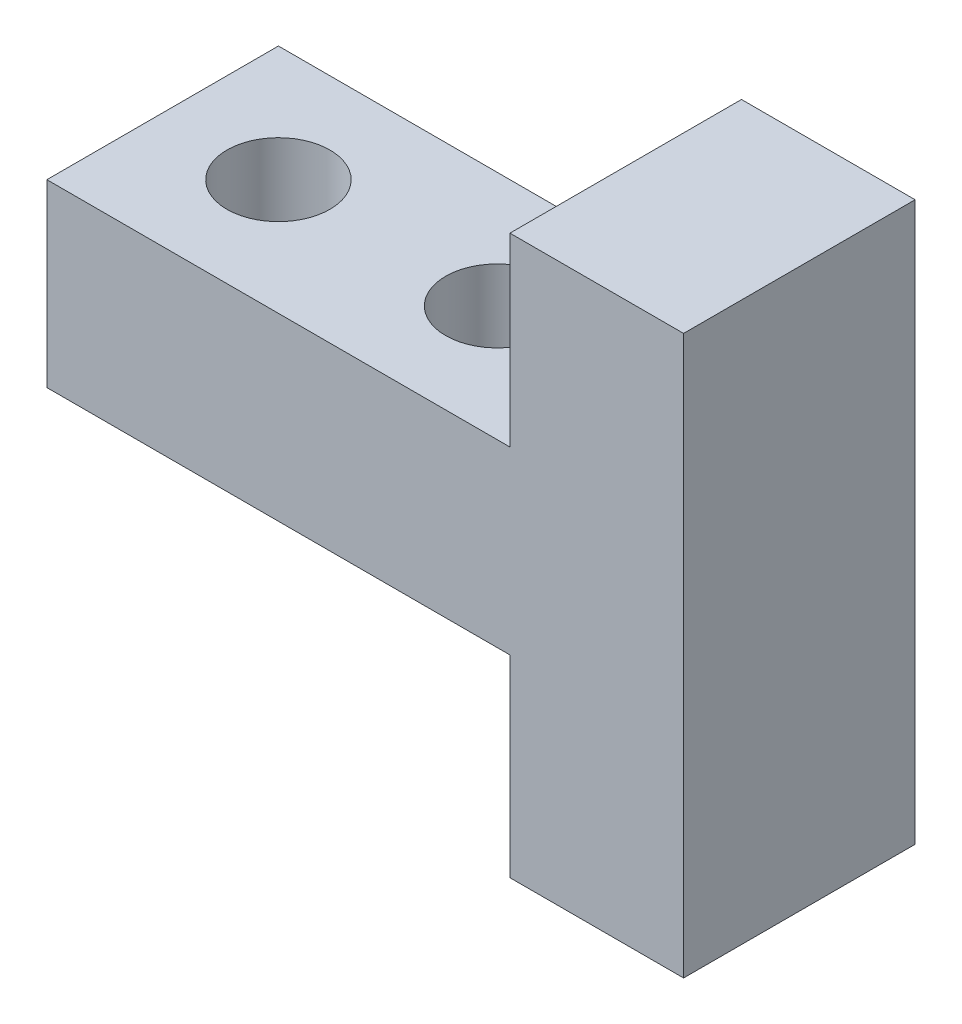
ISO-10303-21;
HEADER;
FILE_DESCRIPTION(('STEP AP214'),'2;1');
FILE_NAME('part.step','',(''),(''),'','','');
FILE_SCHEMA(('AUTOMOTIVE_DESIGN { 1 0 10303 214 1 1 1 1 }'));
ENDSEC;
DATA;
#1=APPLICATION_CONTEXT('core data for automotive mechanical design processes');
#2=APPLICATION_PROTOCOL_DEFINITION('international standard','automotive_design',2000,#1);
#3=PRODUCT_CONTEXT('',#1,'mechanical');
#4=PRODUCT('Part','Part','',(#3));
#5=PRODUCT_RELATED_PRODUCT_CATEGORY('part','',(#4));
#6=PRODUCT_DEFINITION_FORMATION('','',#4);
#7=PRODUCT_DEFINITION_CONTEXT('part definition',#1,'design');
#8=PRODUCT_DEFINITION('design','',#6,#7);
#9=PRODUCT_DEFINITION_SHAPE('','',#8);
#10=(LENGTH_UNIT() NAMED_UNIT(*) SI_UNIT(.MILLI.,.METRE.));
#11=(NAMED_UNIT(*) PLANE_ANGLE_UNIT() SI_UNIT($,.RADIAN.));
#12=(NAMED_UNIT(*) SI_UNIT($,.STERADIAN.) SOLID_ANGLE_UNIT());
#13=UNCERTAINTY_MEASURE_WITH_UNIT(LENGTH_MEASURE(1.E-05),#10,'distance_accuracy_value','');
#14=(GEOMETRIC_REPRESENTATION_CONTEXT(3) GLOBAL_UNCERTAINTY_ASSIGNED_CONTEXT((#13)) GLOBAL_UNIT_ASSIGNED_CONTEXT((#10,
#11,#12)) REPRESENTATION_CONTEXT('',''));
#15=CARTESIAN_POINT('',(0.,0.,0.));
#16=DIRECTION('',(0.,0.,1.));
#17=DIRECTION('',(1.,0.,0.));
#18=AXIS2_PLACEMENT_3D('',#15,#16,#17);
#19=CARTESIAN_POINT('',(-13.5,14.,9.));
#20=DIRECTION('',(1.,0.,0.));
#21=DIRECTION('',(0.,0.,-1.));
#22=AXIS2_PLACEMENT_3D('',#19,#20,#21);
#23=PLANE('',#22);
#24=DIRECTION('',(0.,-1.,0.));
#25=VECTOR('',#24,1.);
#26=CARTESIAN_POINT('',(-13.5,14.,-9.));
#27=LINE('',#26,#25);
#28=CARTESIAN_POINT('',(-13.5,28.4,-9.));
#29=VERTEX_POINT('',#28);
#30=CARTESIAN_POINT('',(-13.5,14.,-9.));
#31=VERTEX_POINT('',#30);
#32=EDGE_CURVE('E133',#29,#31,#27,.T.);
#33=ORIENTED_EDGE('',*,*,#32,.T.);
#34=DIRECTION('',(0.,0.,-1.));
#35=VECTOR('',#34,1.);
#36=CARTESIAN_POINT('',(-13.5,14.,9.));
#37=LINE('',#36,#35);
#38=CARTESIAN_POINT('',(-13.5,14.,9.));
#39=VERTEX_POINT('',#38);
#40=EDGE_CURVE('E11',#39,#31,#37,.T.);
#41=ORIENTED_EDGE('',*,*,#40,.F.);
#42=DIRECTION('',(0.,-1.,0.));
#43=VECTOR('',#42,1.);
#44=CARTESIAN_POINT('',(-13.5,14.,9.));
#45=LINE('',#44,#43);
#46=CARTESIAN_POINT('',(-13.5,28.4,9.));
#47=VERTEX_POINT('',#46);
#48=EDGE_CURVE('E148',#47,#39,#45,.T.);
#49=ORIENTED_EDGE('',*,*,#48,.F.);
#50=DIRECTION('',(0.,0.,-1.));
#51=VECTOR('',#50,1.);
#52=CARTESIAN_POINT('',(-13.5,28.4,9.));
#53=LINE('',#52,#51);
#54=EDGE_CURVE('E129',#47,#29,#53,.T.);
#55=ORIENTED_EDGE('',*,*,#54,.T.);
#56=EDGE_LOOP('',(#33,#41,#49,#55));
#57=FACE_BOUND('',#56,.T.);
#58=ADVANCED_FACE('F35',(#57),#23,.F.);
#59=CARTESIAN_POINT('',(-49.5,14.,9.));
#60=DIRECTION('',(0.,-1.,0.));
#61=DIRECTION('',(0.,0.,-1.));
#62=AXIS2_PLACEMENT_3D('',#59,#60,#61);
#63=PLANE('',#62);
#64=CARTESIAN_POINT('',(-23.5,14.,0.));
#65=DIRECTION('',(0.,1.,0.));
#66=DIRECTION('',(0.,0.,1.));
#67=AXIS2_PLACEMENT_3D('',#64,#65,#66);
#68=CIRCLE('',#67,4.);
#69=CARTESIAN_POINT('',(-23.5,14.,4.));
#70=VERTEX_POINT('',#69);
#71=EDGE_CURVE('E168',#70,#70,#68,.T.);
#72=ORIENTED_EDGE('',*,*,#71,.F.);
#73=EDGE_LOOP('',(#72));
#74=FACE_BOUND('',#73,.T.);
#75=CARTESIAN_POINT('',(-40.5,14.,0.));
#76=DIRECTION('',(0.,1.,0.));
#77=DIRECTION('',(0.,0.,1.));
#78=AXIS2_PLACEMENT_3D('',#75,#76,#77);
#79=CIRCLE('',#78,4.);
#80=CARTESIAN_POINT('',(-40.5,14.,4.));
#81=VERTEX_POINT('',#80);
#82=EDGE_CURVE('E160',#81,#81,#79,.T.);
#83=ORIENTED_EDGE('',*,*,#82,.F.);
#84=EDGE_LOOP('',(#83));
#85=FACE_BOUND('',#84,.T.);
#86=DIRECTION('',(-1.,0.,0.));
#87=VECTOR('',#86,1.);
#88=CARTESIAN_POINT('',(-49.5,14.,-9.));
#89=LINE('',#88,#87);
#90=CARTESIAN_POINT('',(-49.5,14.,-9.));
#91=VERTEX_POINT('',#90);
#92=EDGE_CURVE('E136',#31,#91,#89,.T.);
#93=ORIENTED_EDGE('',*,*,#92,.T.);
#94=DIRECTION('',(0.,0.,-1.));
#95=VECTOR('',#94,1.);
#96=CARTESIAN_POINT('',(-49.5,14.,9.));
#97=LINE('',#96,#95);
#98=CARTESIAN_POINT('',(-49.5,14.,9.));
#99=VERTEX_POINT('',#98);
#100=EDGE_CURVE('E44',#99,#91,#97,.T.);
#101=ORIENTED_EDGE('',*,*,#100,.F.);
#102=DIRECTION('',(-1.,0.,0.));
#103=VECTOR('',#102,1.);
#104=CARTESIAN_POINT('',(-49.5,14.,9.));
#105=LINE('',#104,#103);
#106=EDGE_CURVE('E96',#39,#99,#105,.T.);
#107=ORIENTED_EDGE('',*,*,#106,.F.);
#108=ORIENTED_EDGE('',*,*,#40,.T.);
#109=EDGE_LOOP('',(#93,#101,#107,#108));
#110=FACE_BOUND('',#109,.T.);
#111=ADVANCED_FACE('F204',(#74,#85,#110),#63,.F.);
#112=CARTESIAN_POINT('',(-49.5,0.,9.));
#113=DIRECTION('',(1.,0.,0.));
#114=DIRECTION('',(0.,0.,-1.));
#115=AXIS2_PLACEMENT_3D('',#112,#113,#114);
#116=PLANE('',#115);
#117=DIRECTION('',(0.,-1.,0.));
#118=VECTOR('',#117,1.);
#119=CARTESIAN_POINT('',(-49.5,0.,-9.));
#120=LINE('',#119,#118);
#121=CARTESIAN_POINT('',(-49.5,0.,-9.));
#122=VERTEX_POINT('',#121);
#123=EDGE_CURVE('E139',#91,#122,#120,.T.);
#124=ORIENTED_EDGE('',*,*,#123,.T.);
#125=DIRECTION('',(0.,0.,-1.));
#126=VECTOR('',#125,1.);
#127=CARTESIAN_POINT('',(-49.5,0.,9.));
#128=LINE('',#127,#126);
#129=CARTESIAN_POINT('',(-49.5,0.,9.));
#130=VERTEX_POINT('',#129);
#131=EDGE_CURVE('E155',#130,#122,#128,.T.);
#132=ORIENTED_EDGE('',*,*,#131,.F.);
#133=DIRECTION('',(0.,-1.,0.));
#134=VECTOR('',#133,1.);
#135=CARTESIAN_POINT('',(-49.5,0.,9.));
#136=LINE('',#135,#134);
#137=EDGE_CURVE('E173',#99,#130,#136,.T.);
#138=ORIENTED_EDGE('',*,*,#137,.F.);
#139=ORIENTED_EDGE('',*,*,#100,.T.);
#140=EDGE_LOOP('',(#124,#132,#138,#139));
#141=FACE_BOUND('',#140,.T.);
#142=ADVANCED_FACE('F208',(#141),#116,.F.);
#143=CARTESIAN_POINT('',(-13.5,0.,9.));
#144=DIRECTION('',(0.,1.,0.));
#145=DIRECTION('',(-1.,0.,0.));
#146=AXIS2_PLACEMENT_3D('',#143,#144,#145);
#147=PLANE('',#146);
#148=CARTESIAN_POINT('',(-23.5,0.,0.));
#149=DIRECTION('',(0.,1.,0.));
#150=DIRECTION('',(-1.,0.,0.));
#151=AXIS2_PLACEMENT_3D('',#148,#149,#150);
#152=CIRCLE('',#151,4.);
#153=CARTESIAN_POINT('',(-23.5,0.,4.));
#154=VERTEX_POINT('',#153);
#155=EDGE_CURVE('E38',#154,#154,#152,.T.);
#156=ORIENTED_EDGE('',*,*,#155,.T.);
#157=EDGE_LOOP('',(#156));
#158=FACE_BOUND('',#157,.T.);
#159=CARTESIAN_POINT('',(-40.5,0.,0.));
#160=DIRECTION('',(0.,1.,0.));
#161=DIRECTION('',(-1.,0.,0.));
#162=AXIS2_PLACEMENT_3D('',#159,#160,#161);
#163=CIRCLE('',#162,4.);
#164=CARTESIAN_POINT('',(-40.5,0.,4.));
#165=VERTEX_POINT('',#164);
#166=EDGE_CURVE('E137',#165,#165,#163,.T.);
#167=ORIENTED_EDGE('',*,*,#166,.T.);
#168=EDGE_LOOP('',(#167));
#169=FACE_BOUND('',#168,.T.);
#170=DIRECTION('',(1.,0.,0.));
#171=VECTOR('',#170,1.);
#172=CARTESIAN_POINT('',(-13.5,0.,-9.));
#173=LINE('',#172,#171);
#174=CARTESIAN_POINT('',(-13.5,0.,-9.));
#175=VERTEX_POINT('',#174);
#176=EDGE_CURVE('E141',#122,#175,#173,.T.);
#177=ORIENTED_EDGE('',*,*,#176,.T.);
#178=DIRECTION('',(0.,0.,-1.));
#179=VECTOR('',#178,1.);
#180=CARTESIAN_POINT('',(-13.5,0.,9.));
#181=LINE('',#180,#179);
#182=CARTESIAN_POINT('',(-13.5,0.,9.));
#183=VERTEX_POINT('',#182);
#184=EDGE_CURVE('E152',#183,#175,#181,.T.);
#185=ORIENTED_EDGE('',*,*,#184,.F.);
#186=DIRECTION('',(1.,0.,0.));
#187=VECTOR('',#186,1.);
#188=CARTESIAN_POINT('',(-13.5,0.,9.));
#189=LINE('',#188,#187);
#190=EDGE_CURVE('E175',#130,#183,#189,.T.);
#191=ORIENTED_EDGE('',*,*,#190,.F.);
#192=ORIENTED_EDGE('',*,*,#131,.T.);
#193=EDGE_LOOP('',(#177,#185,#191,#192));
#194=FACE_BOUND('',#193,.T.);
#195=ADVANCED_FACE('F181',(#158,#169,#194),#147,.F.);
#196=CARTESIAN_POINT('',(-13.5,-15.,9.));
#197=DIRECTION('',(1.,0.,0.));
#198=DIRECTION('',(0.,0.,-1.));
#199=AXIS2_PLACEMENT_3D('',#196,#197,#198);
#200=PLANE('',#199);
#201=DIRECTION('',(0.,-1.,0.));
#202=VECTOR('',#201,1.);
#203=CARTESIAN_POINT('',(-13.5,-15.,-9.));
#204=LINE('',#203,#202);
#205=CARTESIAN_POINT('',(-13.5,-15.,-9.));
#206=VERTEX_POINT('',#205);
#207=EDGE_CURVE('E143',#175,#206,#204,.T.);
#208=ORIENTED_EDGE('',*,*,#207,.T.);
#209=DIRECTION('',(0.,0.,-1.));
#210=VECTOR('',#209,1.);
#211=CARTESIAN_POINT('',(-13.5,-15.,9.));
#212=LINE('',#211,#210);
#213=CARTESIAN_POINT('',(-13.5,-15.,9.));
#214=VERTEX_POINT('',#213);
#215=EDGE_CURVE('E124',#214,#206,#212,.T.);
#216=ORIENTED_EDGE('',*,*,#215,.F.);
#217=DIRECTION('',(0.,-1.,0.));
#218=VECTOR('',#217,1.);
#219=CARTESIAN_POINT('',(-13.5,-15.,9.));
#220=LINE('',#219,#218);
#221=EDGE_CURVE('E115',#183,#214,#220,.T.);
#222=ORIENTED_EDGE('',*,*,#221,.F.);
#223=ORIENTED_EDGE('',*,*,#184,.T.);
#224=EDGE_LOOP('',(#208,#216,#222,#223));
#225=FACE_BOUND('',#224,.T.);
#226=ADVANCED_FACE('F185',(#225),#200,.F.);
#227=CARTESIAN_POINT('',(0.,-15.,9.));
#228=DIRECTION('',(0.,1.,0.));
#229=DIRECTION('',(0.,0.,1.));
#230=AXIS2_PLACEMENT_3D('',#227,#228,#229);
#231=PLANE('',#230);
#232=DIRECTION('',(1.,0.,0.));
#233=VECTOR('',#232,1.);
#234=CARTESIAN_POINT('',(0.,-15.,-9.));
#235=LINE('',#234,#233);
#236=CARTESIAN_POINT('',(0.,-15.,-9.));
#237=VERTEX_POINT('',#236);
#238=EDGE_CURVE('E123',#206,#237,#235,.T.);
#239=ORIENTED_EDGE('',*,*,#238,.T.);
#240=DIRECTION('',(0.,0.,-1.));
#241=VECTOR('',#240,1.);
#242=CARTESIAN_POINT('',(0.,-15.,9.));
#243=LINE('',#242,#241);
#244=CARTESIAN_POINT('',(0.,-15.,9.));
#245=VERTEX_POINT('',#244);
#246=EDGE_CURVE('E120',#245,#237,#243,.T.);
#247=ORIENTED_EDGE('',*,*,#246,.F.);
#248=DIRECTION('',(1.,0.,0.));
#249=VECTOR('',#248,1.);
#250=CARTESIAN_POINT('',(0.,-15.,9.));
#251=LINE('',#250,#249);
#252=EDGE_CURVE('E109',#214,#245,#251,.T.);
#253=ORIENTED_EDGE('',*,*,#252,.F.);
#254=ORIENTED_EDGE('',*,*,#215,.T.);
#255=EDGE_LOOP('',(#239,#247,#253,#254));
#256=FACE_BOUND('',#255,.T.);
#257=ADVANCED_FACE('F121',(#256),#231,.F.);
#258=CARTESIAN_POINT('',(0.,28.4,9.));
#259=DIRECTION('',(-1.,0.,0.));
#260=DIRECTION('',(0.,-1.,0.));
#261=AXIS2_PLACEMENT_3D('',#258,#259,#260);
#262=PLANE('',#261);
#263=DIRECTION('',(0.,1.,0.));
#264=VECTOR('',#263,1.);
#265=CARTESIAN_POINT('',(0.,28.4,-9.));
#266=LINE('',#265,#264);
#267=CARTESIAN_POINT('',(0.,28.4,-9.));
#268=VERTEX_POINT('',#267);
#269=EDGE_CURVE('E82',#237,#268,#266,.T.);
#270=ORIENTED_EDGE('',*,*,#269,.T.);
#271=DIRECTION('',(0.,0.,-1.));
#272=VECTOR('',#271,1.);
#273=CARTESIAN_POINT('',(0.,28.4,9.));
#274=LINE('',#273,#272);
#275=CARTESIAN_POINT('',(0.,28.4,9.));
#276=VERTEX_POINT('',#275);
#277=EDGE_CURVE('E125',#276,#268,#274,.T.);
#278=ORIENTED_EDGE('',*,*,#277,.F.);
#279=DIRECTION('',(0.,1.,0.));
#280=VECTOR('',#279,1.);
#281=CARTESIAN_POINT('',(0.,28.4,9.));
#282=LINE('',#281,#280);
#283=EDGE_CURVE('E113',#245,#276,#282,.T.);
#284=ORIENTED_EDGE('',*,*,#283,.F.);
#285=ORIENTED_EDGE('',*,*,#246,.T.);
#286=EDGE_LOOP('',(#270,#278,#284,#285));
#287=FACE_BOUND('',#286,.T.);
#288=ADVANCED_FACE('F127',(#287),#262,.F.);
#289=CARTESIAN_POINT('',(-13.5,28.4,9.));
#290=DIRECTION('',(0.,-1.,0.));
#291=DIRECTION('',(1.,0.,0.));
#292=AXIS2_PLACEMENT_3D('',#289,#290,#291);
#293=PLANE('',#292);
#294=DIRECTION('',(-1.,0.,0.));
#295=VECTOR('',#294,1.);
#296=CARTESIAN_POINT('',(-13.5,28.4,-9.));
#297=LINE('',#296,#295);
#298=EDGE_CURVE('E88',#268,#29,#297,.T.);
#299=ORIENTED_EDGE('',*,*,#298,.T.);
#300=ORIENTED_EDGE('',*,*,#54,.F.);
#301=DIRECTION('',(-1.,0.,0.));
#302=VECTOR('',#301,1.);
#303=CARTESIAN_POINT('',(-13.5,28.4,9.));
#304=LINE('',#303,#302);
#305=EDGE_CURVE('E53',#276,#47,#304,.T.);
#306=ORIENTED_EDGE('',*,*,#305,.F.);
#307=ORIENTED_EDGE('',*,*,#277,.T.);
#308=EDGE_LOOP('',(#299,#300,#306,#307));
#309=FACE_BOUND('',#308,.T.);
#310=ADVANCED_FACE('F193',(#309),#293,.F.);
#311=CARTESIAN_POINT('',(-13.5,-15.,9.));
#312=DIRECTION('',(0.,0.,1.));
#313=DIRECTION('',(1.,0.,0.));
#314=AXIS2_PLACEMENT_3D('',#311,#312,#313);
#315=PLANE('',#314);
#316=ORIENTED_EDGE('',*,*,#48,.T.);
#317=ORIENTED_EDGE('',*,*,#106,.T.);
#318=ORIENTED_EDGE('',*,*,#137,.T.);
#319=ORIENTED_EDGE('',*,*,#190,.T.);
#320=ORIENTED_EDGE('',*,*,#221,.T.);
#321=ORIENTED_EDGE('',*,*,#252,.T.);
#322=ORIENTED_EDGE('',*,*,#283,.T.);
#323=ORIENTED_EDGE('',*,*,#305,.T.);
#324=EDGE_LOOP('',(#316,#317,#318,#319,#320,#321,#322,#323));
#325=FACE_BOUND('',#324,.T.);
#326=ADVANCED_FACE('F111',(#325),#315,.T.);
#327=CARTESIAN_POINT('',(-13.5,-15.,-9.));
#328=DIRECTION('',(0.,0.,1.));
#329=DIRECTION('',(1.,0.,0.));
#330=AXIS2_PLACEMENT_3D('',#327,#328,#329);
#331=PLANE('',#330);
#332=ORIENTED_EDGE('',*,*,#32,.F.);
#333=ORIENTED_EDGE('',*,*,#298,.F.);
#334=ORIENTED_EDGE('',*,*,#269,.F.);
#335=ORIENTED_EDGE('',*,*,#238,.F.);
#336=ORIENTED_EDGE('',*,*,#207,.F.);
#337=ORIENTED_EDGE('',*,*,#176,.F.);
#338=ORIENTED_EDGE('',*,*,#123,.F.);
#339=ORIENTED_EDGE('',*,*,#92,.F.);
#340=EDGE_LOOP('',(#332,#333,#334,#335,#336,#337,#338,#339));
#341=FACE_BOUND('',#340,.T.);
#342=ADVANCED_FACE('F188',(#341),#331,.F.);
#343=CARTESIAN_POINT('',(-40.5,-15.,0.));
#344=DIRECTION('',(0.,1.,0.));
#345=DIRECTION('',(0.,0.,1.));
#346=AXIS2_PLACEMENT_3D('',#343,#344,#345);
#347=CYLINDRICAL_SURFACE('',#346,4.);
#348=CARTESIAN_POINT('',(-40.5,14.,4.));
#349=CARTESIAN_POINT('',(-40.5,13.8541666666667,4.));
#350=CARTESIAN_POINT('',(-40.5,13.7083333333333,4.));
#351=CARTESIAN_POINT('',(-40.5,13.4166666666667,4.));
#352=CARTESIAN_POINT('',(-40.5,13.2708333333333,4.));
#353=CARTESIAN_POINT('',(-40.5,12.9791666666667,4.));
#354=CARTESIAN_POINT('',(-40.5,12.8333333333333,4.));
#355=CARTESIAN_POINT('',(-40.5,12.5416666666667,4.));
#356=CARTESIAN_POINT('',(-40.5,12.3958333333333,4.));
#357=CARTESIAN_POINT('',(-40.5,12.1041666666667,4.));
#358=CARTESIAN_POINT('',(-40.5,11.9583333333333,4.));
#359=CARTESIAN_POINT('',(-40.5,11.6666666666667,4.));
#360=CARTESIAN_POINT('',(-40.5,11.5208333333333,4.));
#361=CARTESIAN_POINT('',(-40.5,11.2291666666667,4.));
#362=CARTESIAN_POINT('',(-40.5,11.0833333333333,4.));
#363=CARTESIAN_POINT('',(-40.5,10.7916666666667,4.));
#364=CARTESIAN_POINT('',(-40.5,10.6458333333333,4.));
#365=CARTESIAN_POINT('',(-40.5,10.3541666666667,4.));
#366=CARTESIAN_POINT('',(-40.5,10.2083333333333,4.));
#367=CARTESIAN_POINT('',(-40.5,9.91666666666666,4.));
#368=CARTESIAN_POINT('',(-40.5,9.77083333333333,4.));
#369=CARTESIAN_POINT('',(-40.5,9.47916666666666,4.));
#370=CARTESIAN_POINT('',(-40.5,9.33333333333333,4.));
#371=CARTESIAN_POINT('',(-40.5,9.04166666666666,4.));
#372=CARTESIAN_POINT('',(-40.5,8.89583333333333,4.));
#373=CARTESIAN_POINT('',(-40.5,8.60416666666666,4.));
#374=CARTESIAN_POINT('',(-40.5,8.45833333333333,4.));
#375=CARTESIAN_POINT('',(-40.5,8.16666666666666,4.));
#376=CARTESIAN_POINT('',(-40.5,8.02083333333333,4.));
#377=CARTESIAN_POINT('',(-40.5,7.72916666666666,4.));
#378=CARTESIAN_POINT('',(-40.5,7.58333333333333,4.));
#379=CARTESIAN_POINT('',(-40.5,7.29166666666666,4.));
#380=CARTESIAN_POINT('',(-40.5,7.14583333333333,4.));
#381=CARTESIAN_POINT('',(-40.5,6.85416666666666,4.));
#382=CARTESIAN_POINT('',(-40.5,6.70833333333333,4.));
#383=CARTESIAN_POINT('',(-40.5,6.41666666666666,4.));
#384=CARTESIAN_POINT('',(-40.5,6.27083333333333,4.));
#385=CARTESIAN_POINT('',(-40.5,5.97916666666666,4.));
#386=CARTESIAN_POINT('',(-40.5,5.83333333333333,4.));
#387=CARTESIAN_POINT('',(-40.5,5.54166666666666,4.));
#388=CARTESIAN_POINT('',(-40.5,5.39583333333333,4.));
#389=CARTESIAN_POINT('',(-40.5,5.10416666666666,4.));
#390=CARTESIAN_POINT('',(-40.5,4.95833333333333,4.));
#391=CARTESIAN_POINT('',(-40.5,4.66666666666666,4.));
#392=CARTESIAN_POINT('',(-40.5,4.52083333333333,4.));
#393=CARTESIAN_POINT('',(-40.5,4.22916666666666,4.));
#394=CARTESIAN_POINT('',(-40.5,4.08333333333333,4.));
#395=CARTESIAN_POINT('',(-40.5,3.79166666666666,4.));
#396=CARTESIAN_POINT('',(-40.5,3.64583333333333,4.));
#397=CARTESIAN_POINT('',(-40.5,3.35416666666666,4.));
#398=CARTESIAN_POINT('',(-40.5,3.20833333333333,4.));
#399=CARTESIAN_POINT('',(-40.5,2.91666666666666,4.));
#400=CARTESIAN_POINT('',(-40.5,2.77083333333333,4.));
#401=CARTESIAN_POINT('',(-40.5,2.47916666666666,4.));
#402=CARTESIAN_POINT('',(-40.5,2.33333333333333,4.));
#403=CARTESIAN_POINT('',(-40.5,2.04166666666666,4.));
#404=CARTESIAN_POINT('',(-40.5,1.89583333333333,4.));
#405=CARTESIAN_POINT('',(-40.5,1.60416666666666,4.));
#406=CARTESIAN_POINT('',(-40.5,1.45833333333333,4.));
#407=CARTESIAN_POINT('',(-40.5,1.16666666666666,4.));
#408=CARTESIAN_POINT('',(-40.5,1.02083333333333,4.));
#409=CARTESIAN_POINT('',(-40.5,0.729166666666661,4.));
#410=CARTESIAN_POINT('',(-40.5,0.583333333333328,4.));
#411=CARTESIAN_POINT('',(-40.5,0.291666666666662,4.));
#412=CARTESIAN_POINT('',(-40.5,0.145833333333328,4.));
#413=CARTESIAN_POINT('',(-40.5,0.,4.));
#414=B_SPLINE_CURVE_WITH_KNOTS('',3,(#348,#349,#350,#351,#352,#353,#354,#355,#356,#357,#358,
#359,#360,#361,#362,#363,#364,#365,#366,#367,#368,#369,#370,#371,#372,#373,#374,#375,#376,#377,
#378,#379,#380,#381,#382,#383,#384,#385,#386,#387,#388,#389,#390,#391,#392,#393,#394,#395,#396,
#397,#398,#399,#400,#401,#402,#403,#404,#405,#406,#407,#408,#409,#410,#411,#412,#413),
.UNSPECIFIED.,.F.,.F.,(4,2,2,2,2,2,2,2,2,2,2,2,2,2,2,2,2,2,2,2,2,2,2,2,2,2,2,2,2,2,2,2,4),(0.,
0.4375,0.875000000000001,1.3125,1.75,2.1875,2.625,3.0625,3.5,3.9375,4.375,4.8125,5.25,5.6875,
6.125,6.5625,7.,7.4375,7.875,8.3125,8.75,9.1875,9.625,10.0625,10.5,10.9375,11.375,11.8125,12.25,
12.6875,13.125,13.5625,14.),.UNSPECIFIED.);
#415=EDGE_CURVE('BSEAM250',#81,#165,#414,.T.);
#416=ORIENTED_EDGE('',*,*,#82,.T.);
#417=ORIENTED_EDGE('',*,*,#166,.F.);
#418=ORIENTED_EDGE('',*,*,#415,.T.);
#419=ORIENTED_EDGE('',*,*,#415,.F.);
#420=EDGE_LOOP('',(#416,#418,#417,#419));
#421=FACE_BOUND('',#420,.T.);
#422=ADVANCED_FACE('F250',(#421),#347,.F.);
#423=CARTESIAN_POINT('',(-23.5,-15.,0.));
#424=DIRECTION('',(0.,1.,0.));
#425=DIRECTION('',(0.,0.,1.));
#426=AXIS2_PLACEMENT_3D('',#423,#424,#425);
#427=CYLINDRICAL_SURFACE('',#426,4.);
#428=CARTESIAN_POINT('',(-23.5,14.,4.));
#429=CARTESIAN_POINT('',(-23.5,13.8541666666667,4.));
#430=CARTESIAN_POINT('',(-23.5,13.7083333333333,4.));
#431=CARTESIAN_POINT('',(-23.5,13.4166666666667,4.));
#432=CARTESIAN_POINT('',(-23.5,13.2708333333333,4.));
#433=CARTESIAN_POINT('',(-23.5,12.9791666666667,4.));
#434=CARTESIAN_POINT('',(-23.5,12.8333333333333,4.));
#435=CARTESIAN_POINT('',(-23.5,12.5416666666667,4.));
#436=CARTESIAN_POINT('',(-23.5,12.3958333333333,4.));
#437=CARTESIAN_POINT('',(-23.5,12.1041666666667,4.));
#438=CARTESIAN_POINT('',(-23.5,11.9583333333333,4.));
#439=CARTESIAN_POINT('',(-23.5,11.6666666666667,4.));
#440=CARTESIAN_POINT('',(-23.5,11.5208333333333,4.));
#441=CARTESIAN_POINT('',(-23.5,11.2291666666667,4.));
#442=CARTESIAN_POINT('',(-23.5,11.0833333333333,4.));
#443=CARTESIAN_POINT('',(-23.5,10.7916666666667,4.));
#444=CARTESIAN_POINT('',(-23.5,10.6458333333333,4.));
#445=CARTESIAN_POINT('',(-23.5,10.3541666666667,4.));
#446=CARTESIAN_POINT('',(-23.5,10.2083333333333,4.));
#447=CARTESIAN_POINT('',(-23.5,9.91666666666667,4.));
#448=CARTESIAN_POINT('',(-23.5,9.77083333333333,4.));
#449=CARTESIAN_POINT('',(-23.5,9.47916666666667,4.));
#450=CARTESIAN_POINT('',(-23.5,9.33333333333333,4.));
#451=CARTESIAN_POINT('',(-23.5,9.04166666666666,4.));
#452=CARTESIAN_POINT('',(-23.5,8.89583333333333,4.));
#453=CARTESIAN_POINT('',(-23.5,8.60416666666666,4.));
#454=CARTESIAN_POINT('',(-23.5,8.45833333333333,4.));
#455=CARTESIAN_POINT('',(-23.5,8.16666666666666,4.));
#456=CARTESIAN_POINT('',(-23.5,8.02083333333333,4.));
#457=CARTESIAN_POINT('',(-23.5,7.72916666666666,4.));
#458=CARTESIAN_POINT('',(-23.5,7.58333333333333,4.));
#459=CARTESIAN_POINT('',(-23.5,7.29166666666667,4.));
#460=CARTESIAN_POINT('',(-23.5,7.14583333333333,4.));
#461=CARTESIAN_POINT('',(-23.5,6.85416666666667,4.));
#462=CARTESIAN_POINT('',(-23.5,6.70833333333333,4.));
#463=CARTESIAN_POINT('',(-23.5,6.41666666666667,4.));
#464=CARTESIAN_POINT('',(-23.5,6.27083333333333,4.));
#465=CARTESIAN_POINT('',(-23.5,5.97916666666667,4.));
#466=CARTESIAN_POINT('',(-23.5,5.83333333333333,4.));
#467=CARTESIAN_POINT('',(-23.5,5.54166666666666,4.));
#468=CARTESIAN_POINT('',(-23.5,5.39583333333333,4.));
#469=CARTESIAN_POINT('',(-23.5,5.10416666666666,4.));
#470=CARTESIAN_POINT('',(-23.5,4.95833333333333,4.));
#471=CARTESIAN_POINT('',(-23.5,4.66666666666666,4.));
#472=CARTESIAN_POINT('',(-23.5,4.52083333333333,4.));
#473=CARTESIAN_POINT('',(-23.5,4.22916666666666,4.));
#474=CARTESIAN_POINT('',(-23.5,4.08333333333333,4.));
#475=CARTESIAN_POINT('',(-23.5,3.79166666666666,4.));
#476=CARTESIAN_POINT('',(-23.5,3.64583333333333,4.));
#477=CARTESIAN_POINT('',(-23.5,3.35416666666666,4.));
#478=CARTESIAN_POINT('',(-23.5,3.20833333333333,4.));
#479=CARTESIAN_POINT('',(-23.5,2.91666666666666,4.));
#480=CARTESIAN_POINT('',(-23.5,2.77083333333333,4.));
#481=CARTESIAN_POINT('',(-23.5,2.47916666666666,4.));
#482=CARTESIAN_POINT('',(-23.5,2.33333333333333,4.));
#483=CARTESIAN_POINT('',(-23.5,2.04166666666666,4.));
#484=CARTESIAN_POINT('',(-23.5,1.89583333333333,4.));
#485=CARTESIAN_POINT('',(-23.5,1.60416666666666,4.));
#486=CARTESIAN_POINT('',(-23.5,1.45833333333333,4.));
#487=CARTESIAN_POINT('',(-23.5,1.16666666666666,4.));
#488=CARTESIAN_POINT('',(-23.5,1.02083333333333,4.));
#489=CARTESIAN_POINT('',(-23.5,0.729166666666664,4.));
#490=CARTESIAN_POINT('',(-23.5,0.583333333333331,4.));
#491=CARTESIAN_POINT('',(-23.5,0.291666666666665,4.));
#492=CARTESIAN_POINT('',(-23.5,0.145833333333332,4.));
#493=CARTESIAN_POINT('',(-23.5,0.,4.));
#494=B_SPLINE_CURVE_WITH_KNOTS('',3,(#428,#429,#430,#431,#432,#433,#434,#435,#436,#437,#438,
#439,#440,#441,#442,#443,#444,#445,#446,#447,#448,#449,#450,#451,#452,#453,#454,#455,#456,#457,
#458,#459,#460,#461,#462,#463,#464,#465,#466,#467,#468,#469,#470,#471,#472,#473,#474,#475,#476,
#477,#478,#479,#480,#481,#482,#483,#484,#485,#486,#487,#488,#489,#490,#491,#492,#493),
.UNSPECIFIED.,.F.,.F.,(4,2,2,2,2,2,2,2,2,2,2,2,2,2,2,2,2,2,2,2,2,2,2,2,2,2,2,2,2,2,2,2,4),(0.,
0.4375,0.875000000000001,1.3125,1.75,2.1875,2.625,3.0625,3.5,3.9375,4.375,4.8125,5.25,5.6875,
6.125,6.5625,7.,7.4375,7.875,8.3125,8.75,9.1875,9.625,10.0625,10.5,10.9375,11.375,11.8125,12.25,
12.6875,13.125,13.5625,14.),.UNSPECIFIED.);
#495=EDGE_CURVE('BSEAM272',#70,#154,#494,.T.);
#496=ORIENTED_EDGE('',*,*,#71,.T.);
#497=ORIENTED_EDGE('',*,*,#155,.F.);
#498=ORIENTED_EDGE('',*,*,#495,.T.);
#499=ORIENTED_EDGE('',*,*,#495,.F.);
#500=EDGE_LOOP('',(#496,#498,#497,#499));
#501=FACE_BOUND('',#500,.T.);
#502=ADVANCED_FACE('F272',(#501),#427,.F.);
#503=CLOSED_SHELL('',(#58,#111,#142,#195,#226,#257,#288,#310,#326,#342,#422,#502));
#504=MANIFOLD_SOLID_BREP('B2',#503);
#505=ADVANCED_BREP_SHAPE_REPRESENTATION('',(#18,#504),#14);
#506=SHAPE_DEFINITION_REPRESENTATION(#9,#505);
ENDSEC;
END-ISO-10303-21;
